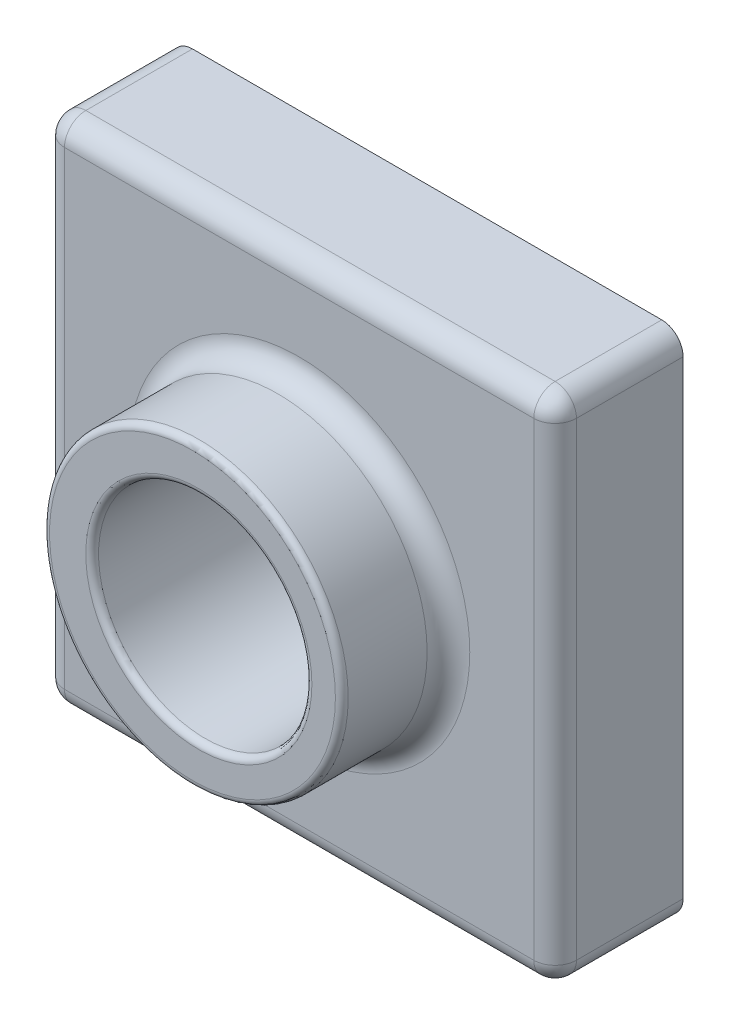
ISO-10303-21;
HEADER;
FILE_DESCRIPTION(('STEP AP214'),'2;1');
FILE_NAME('part.step','',(''),(''),'','','');
FILE_SCHEMA(('AUTOMOTIVE_DESIGN { 1 0 10303 214 1 1 1 1 }'));
ENDSEC;
DATA;
#1=APPLICATION_CONTEXT('core data for automotive mechanical design processes');
#2=APPLICATION_PROTOCOL_DEFINITION('international standard','automotive_design',2000,#1);
#3=PRODUCT_CONTEXT('',#1,'mechanical');
#4=PRODUCT('Part','Part','',(#3));
#5=PRODUCT_RELATED_PRODUCT_CATEGORY('part','',(#4));
#6=PRODUCT_DEFINITION_FORMATION('','',#4);
#7=PRODUCT_DEFINITION_CONTEXT('part definition',#1,'design');
#8=PRODUCT_DEFINITION('design','',#6,#7);
#9=PRODUCT_DEFINITION_SHAPE('','',#8);
#10=(LENGTH_UNIT() NAMED_UNIT(*) SI_UNIT(.MILLI.,.METRE.));
#11=(NAMED_UNIT(*) PLANE_ANGLE_UNIT() SI_UNIT($,.RADIAN.));
#12=(NAMED_UNIT(*) SI_UNIT($,.STERADIAN.) SOLID_ANGLE_UNIT());
#13=UNCERTAINTY_MEASURE_WITH_UNIT(LENGTH_MEASURE(1.E-05),#10,'distance_accuracy_value','');
#14=(GEOMETRIC_REPRESENTATION_CONTEXT(3) GLOBAL_UNCERTAINTY_ASSIGNED_CONTEXT((#13)) GLOBAL_UNIT_ASSIGNED_CONTEXT((#10,
#11,#12)) REPRESENTATION_CONTEXT('',''));
#15=CARTESIAN_POINT('',(0.,0.,0.));
#16=DIRECTION('',(0.,0.,1.));
#17=DIRECTION('',(1.,0.,0.));
#18=AXIS2_PLACEMENT_3D('',#15,#16,#17);
#19=CARTESIAN_POINT('',(0.,0.,0.));
#20=DIRECTION('',(0.,0.,1.));
#21=DIRECTION('',(1.,0.,0.));
#22=AXIS2_PLACEMENT_3D('',#19,#20,#21);
#23=PLANE('',#22);
#24=DIRECTION('',(1.,0.,0.));
#25=VECTOR('',#24,1.);
#26=CARTESIAN_POINT('',(0.,0.,0.));
#27=LINE('',#26,#25);
#28=CARTESIAN_POINT('',(5.,0.,0.));
#29=VERTEX_POINT('',#28);
#30=CARTESIAN_POINT('',(115.,0.,0.));
#31=VERTEX_POINT('',#30);
#32=EDGE_CURVE('E353',#29,#31,#27,.T.);
#33=ORIENTED_EDGE('',*,*,#32,.F.);
#34=CARTESIAN_POINT('',(5.,5.,0.));
#35=DIRECTION('',(0.,0.,1.));
#36=DIRECTION('',(1.,0.,0.));
#37=AXIS2_PLACEMENT_3D('',#34,#35,#36);
#38=CIRCLE('',#37,5.);
#39=CARTESIAN_POINT('',(0.,5.,0.));
#40=VERTEX_POINT('',#39);
#41=EDGE_CURVE('E427',#29,#40,#38,.F.);
#42=ORIENTED_EDGE('',*,*,#41,.T.);
#43=DIRECTION('',(0.,1.,0.));
#44=VECTOR('',#43,1.);
#45=CARTESIAN_POINT('',(0.,0.,0.));
#46=LINE('',#45,#44);
#47=CARTESIAN_POINT('',(0.,115.,0.));
#48=VERTEX_POINT('',#47);
#49=EDGE_CURVE('E357',#40,#48,#46,.T.);
#50=ORIENTED_EDGE('',*,*,#49,.T.);
#51=CARTESIAN_POINT('',(4.99999999999996,115.,0.));
#52=DIRECTION('',(0.,0.,1.));
#53=DIRECTION('',(1.,0.,0.));
#54=AXIS2_PLACEMENT_3D('',#51,#52,#53);
#55=CIRCLE('',#54,5.);
#56=CARTESIAN_POINT('',(4.99999999999996,120.,0.));
#57=VERTEX_POINT('',#56);
#58=EDGE_CURVE('E424',#48,#57,#55,.F.);
#59=ORIENTED_EDGE('',*,*,#58,.T.);
#60=DIRECTION('',(1.,0.,0.));
#61=VECTOR('',#60,1.);
#62=CARTESIAN_POINT('',(0.,120.,0.));
#63=LINE('',#62,#61);
#64=CARTESIAN_POINT('',(115.,120.,0.));
#65=VERTEX_POINT('',#64);
#66=EDGE_CURVE('E344',#57,#65,#63,.T.);
#67=ORIENTED_EDGE('',*,*,#66,.T.);
#68=CARTESIAN_POINT('',(115.,115.,0.));
#69=DIRECTION('',(0.,0.,1.));
#70=DIRECTION('',(1.,0.,0.));
#71=AXIS2_PLACEMENT_3D('',#68,#69,#70);
#72=CIRCLE('',#71,5.);
#73=CARTESIAN_POINT('',(120.,115.,0.));
#74=VERTEX_POINT('',#73);
#75=EDGE_CURVE('E418',#65,#74,#72,.F.);
#76=ORIENTED_EDGE('',*,*,#75,.T.);
#77=DIRECTION('',(0.,1.,0.));
#78=VECTOR('',#77,1.);
#79=CARTESIAN_POINT('',(120.,0.,0.));
#80=LINE('',#79,#78);
#81=CARTESIAN_POINT('',(120.,5.,0.));
#82=VERTEX_POINT('',#81);
#83=EDGE_CURVE('E349',#82,#74,#80,.T.);
#84=ORIENTED_EDGE('',*,*,#83,.F.);
#85=CARTESIAN_POINT('',(115.,5.,0.));
#86=DIRECTION('',(0.,0.,1.));
#87=DIRECTION('',(1.,0.,0.));
#88=AXIS2_PLACEMENT_3D('',#85,#86,#87);
#89=CIRCLE('',#88,5.);
#90=EDGE_CURVE('E421',#82,#31,#89,.F.);
#91=ORIENTED_EDGE('',*,*,#90,.T.);
#92=EDGE_LOOP('',(#33,#42,#50,#59,#67,#76,#84,#91));
#93=FACE_BOUND('',#92,.T.);
#94=CARTESIAN_POINT('',(5.,5.,0.));
#95=DIRECTION('',(0.,0.,1.));
#96=DIRECTION('',(1.,0.,0.));
#97=AXIS2_PLACEMENT_3D('',#94,#95,#96);
#98=CIRCLE('',#97,3.);
#99=CARTESIAN_POINT('',(5.,2.,0.));
#100=VERTEX_POINT('',#99);
#101=CARTESIAN_POINT('',(2.,5.,0.));
#102=VERTEX_POINT('',#101);
#103=EDGE_CURVE('E311',#100,#102,#98,.F.);
#104=ORIENTED_EDGE('',*,*,#103,.F.);
#105=DIRECTION('',(1.,0.,0.));
#106=VECTOR('',#105,1.);
#107=CARTESIAN_POINT('',(0.,2.,0.));
#108=LINE('',#107,#106);
#109=CARTESIAN_POINT('',(115.,2.,0.));
#110=VERTEX_POINT('',#109);
#111=EDGE_CURVE('E324',#100,#110,#108,.T.);
#112=ORIENTED_EDGE('',*,*,#111,.T.);
#113=CARTESIAN_POINT('',(115.,5.,0.));
#114=DIRECTION('',(0.,0.,1.));
#115=DIRECTION('',(1.,0.,0.));
#116=AXIS2_PLACEMENT_3D('',#113,#114,#115);
#117=CIRCLE('',#116,3.);
#118=CARTESIAN_POINT('',(118.,5.,0.));
#119=VERTEX_POINT('',#118);
#120=EDGE_CURVE('E321',#119,#110,#117,.F.);
#121=ORIENTED_EDGE('',*,*,#120,.F.);
#122=DIRECTION('',(0.,1.,0.));
#123=VECTOR('',#122,1.);
#124=CARTESIAN_POINT('',(118.,0.,0.));
#125=LINE('',#124,#123);
#126=CARTESIAN_POINT('',(118.,115.,0.));
#127=VERTEX_POINT('',#126);
#128=EDGE_CURVE('E55',#119,#127,#125,.T.);
#129=ORIENTED_EDGE('',*,*,#128,.T.);
#130=CARTESIAN_POINT('',(115.,115.,0.));
#131=DIRECTION('',(0.,0.,1.));
#132=DIRECTION('',(1.,0.,0.));
#133=AXIS2_PLACEMENT_3D('',#130,#131,#132);
#134=CIRCLE('',#133,3.);
#135=CARTESIAN_POINT('',(115.,118.,0.));
#136=VERTEX_POINT('',#135);
#137=EDGE_CURVE('E305',#136,#127,#134,.F.);
#138=ORIENTED_EDGE('',*,*,#137,.F.);
#139=DIRECTION('',(1.,0.,0.));
#140=VECTOR('',#139,1.);
#141=CARTESIAN_POINT('',(0.,118.,0.));
#142=LINE('',#141,#140);
#143=CARTESIAN_POINT('',(4.99999999999996,118.,0.));
#144=VERTEX_POINT('',#143);
#145=EDGE_CURVE('E316',#144,#136,#142,.T.);
#146=ORIENTED_EDGE('',*,*,#145,.F.);
#147=CARTESIAN_POINT('',(4.99999999999996,115.,0.));
#148=DIRECTION('',(0.,0.,1.));
#149=DIRECTION('',(1.,0.,0.));
#150=AXIS2_PLACEMENT_3D('',#147,#148,#149);
#151=CIRCLE('',#150,3.);
#152=CARTESIAN_POINT('',(1.99999999999996,115.,0.));
#153=VERTEX_POINT('',#152);
#154=EDGE_CURVE('E185',#153,#144,#151,.F.);
#155=ORIENTED_EDGE('',*,*,#154,.F.);
#156=DIRECTION('',(0.,1.,0.));
#157=VECTOR('',#156,1.);
#158=CARTESIAN_POINT('',(2.,0.,0.));
#159=LINE('',#158,#157);
#160=EDGE_CURVE('E271',#102,#153,#159,.T.);
#161=ORIENTED_EDGE('',*,*,#160,.F.);
#162=EDGE_LOOP('',(#104,#112,#121,#129,#138,#146,#155,#161));
#163=FACE_BOUND('',#162,.T.);
#164=ADVANCED_FACE('F39',(#93,#163),#23,.F.);
#165=CARTESIAN_POINT('',(0.,120.,30.));
#166=DIRECTION('',(0.,1.,0.));
#167=DIRECTION('',(0.,0.,1.));
#168=AXIS2_PLACEMENT_3D('',#165,#166,#167);
#169=PLANE('',#168);
#170=ORIENTED_EDGE('',*,*,#66,.F.);
#171=DIRECTION('',(0.,0.,-1.));
#172=VECTOR('',#171,1.);
#173=CARTESIAN_POINT('',(4.99999999999996,120.,30.));
#174=LINE('',#173,#172);
#175=CARTESIAN_POINT('',(4.99999999999996,120.,25.));
#176=VERTEX_POINT('',#175);
#177=EDGE_CURVE('E63',#57,#176,#174,.F.);
#178=ORIENTED_EDGE('',*,*,#177,.T.);
#179=DIRECTION('',(1.,0.,0.));
#180=VECTOR('',#179,1.);
#181=CARTESIAN_POINT('',(0.,120.,25.));
#182=LINE('',#181,#180);
#183=CARTESIAN_POINT('',(115.,120.,25.));
#184=VERTEX_POINT('',#183);
#185=EDGE_CURVE('E409',#176,#184,#182,.T.);
#186=ORIENTED_EDGE('',*,*,#185,.T.);
#187=DIRECTION('',(0.,0.,-1.));
#188=VECTOR('',#187,1.);
#189=CARTESIAN_POINT('',(115.,120.,0.));
#190=LINE('',#189,#188);
#191=EDGE_CURVE('E406',#184,#65,#190,.T.);
#192=ORIENTED_EDGE('',*,*,#191,.T.);
#193=EDGE_LOOP('',(#170,#178,#186,#192));
#194=FACE_BOUND('',#193,.T.);
#195=ADVANCED_FACE('F527',(#194),#169,.T.);
#196=CARTESIAN_POINT('',(0.,0.,30.));
#197=DIRECTION('',(-1.,0.,0.));
#198=DIRECTION('',(0.,-1.,0.));
#199=AXIS2_PLACEMENT_3D('',#196,#197,#198);
#200=PLANE('',#199);
#201=ORIENTED_EDGE('',*,*,#49,.F.);
#202=DIRECTION('',(0.,0.,-1.));
#203=VECTOR('',#202,1.);
#204=CARTESIAN_POINT('',(0.,5.,30.));
#205=LINE('',#204,#203);
#206=CARTESIAN_POINT('',(0.,5.,25.));
#207=VERTEX_POINT('',#206);
#208=EDGE_CURVE('E403',#40,#207,#205,.F.);
#209=ORIENTED_EDGE('',*,*,#208,.T.);
#210=DIRECTION('',(0.,1.,0.));
#211=VECTOR('',#210,1.);
#212=CARTESIAN_POINT('',(0.,0.,25.));
#213=LINE('',#212,#211);
#214=CARTESIAN_POINT('',(0.,115.,25.));
#215=VERTEX_POINT('',#214);
#216=EDGE_CURVE('E400',#207,#215,#213,.T.);
#217=ORIENTED_EDGE('',*,*,#216,.T.);
#218=DIRECTION('',(0.,0.,-1.));
#219=VECTOR('',#218,1.);
#220=CARTESIAN_POINT('',(0.,115.,30.));
#221=LINE('',#220,#219);
#222=EDGE_CURVE('E397',#215,#48,#221,.T.);
#223=ORIENTED_EDGE('',*,*,#222,.T.);
#224=EDGE_LOOP('',(#201,#209,#217,#223));
#225=FACE_BOUND('',#224,.T.);
#226=ADVANCED_FACE('F532',(#225),#200,.T.);
#227=CARTESIAN_POINT('',(0.,0.,30.));
#228=DIRECTION('',(0.,1.,0.));
#229=DIRECTION('',(0.,0.,1.));
#230=AXIS2_PLACEMENT_3D('',#227,#228,#229);
#231=PLANE('',#230);
#232=DIRECTION('',(1.,0.,0.));
#233=VECTOR('',#232,1.);
#234=CARTESIAN_POINT('',(0.,0.,25.));
#235=LINE('',#234,#233);
#236=CARTESIAN_POINT('',(115.,0.,25.));
#237=VERTEX_POINT('',#236);
#238=CARTESIAN_POINT('',(5.,0.,25.));
#239=VERTEX_POINT('',#238);
#240=EDGE_CURVE('E391',#237,#239,#235,.F.);
#241=ORIENTED_EDGE('',*,*,#240,.T.);
#242=DIRECTION('',(0.,0.,-1.));
#243=VECTOR('',#242,1.);
#244=CARTESIAN_POINT('',(5.,0.,0.));
#245=LINE('',#244,#243);
#246=EDGE_CURVE('E394',#239,#29,#245,.T.);
#247=ORIENTED_EDGE('',*,*,#246,.T.);
#248=ORIENTED_EDGE('',*,*,#32,.T.);
#249=DIRECTION('',(0.,0.,-1.));
#250=VECTOR('',#249,1.);
#251=CARTESIAN_POINT('',(115.,0.,30.));
#252=LINE('',#251,#250);
#253=EDGE_CURVE('E388',#31,#237,#252,.F.);
#254=ORIENTED_EDGE('',*,*,#253,.T.);
#255=EDGE_LOOP('',(#241,#247,#248,#254));
#256=FACE_BOUND('',#255,.T.);
#257=ADVANCED_FACE('F909',(#256),#231,.F.);
#258=CARTESIAN_POINT('',(120.,0.,30.));
#259=DIRECTION('',(-1.,0.,0.));
#260=DIRECTION('',(0.,-1.,0.));
#261=AXIS2_PLACEMENT_3D('',#258,#259,#260);
#262=PLANE('',#261);
#263=DIRECTION('',(0.,1.,0.));
#264=VECTOR('',#263,1.);
#265=CARTESIAN_POINT('',(120.,0.,25.));
#266=LINE('',#265,#264);
#267=CARTESIAN_POINT('',(120.,115.,25.));
#268=VERTEX_POINT('',#267);
#269=CARTESIAN_POINT('',(120.,5.,25.));
#270=VERTEX_POINT('',#269);
#271=EDGE_CURVE('E381',#268,#270,#266,.F.);
#272=ORIENTED_EDGE('',*,*,#271,.T.);
#273=DIRECTION('',(0.,0.,-1.));
#274=VECTOR('',#273,1.);
#275=CARTESIAN_POINT('',(120.,5.,30.));
#276=LINE('',#275,#274);
#277=EDGE_CURVE('E385',#270,#82,#276,.T.);
#278=ORIENTED_EDGE('',*,*,#277,.T.);
#279=ORIENTED_EDGE('',*,*,#83,.T.);
#280=DIRECTION('',(0.,0.,-1.));
#281=VECTOR('',#280,1.);
#282=CARTESIAN_POINT('',(120.,115.,30.));
#283=LINE('',#282,#281);
#284=EDGE_CURVE('E378',#74,#268,#283,.F.);
#285=ORIENTED_EDGE('',*,*,#284,.T.);
#286=EDGE_LOOP('',(#272,#278,#279,#285));
#287=FACE_BOUND('',#286,.T.);
#288=ADVANCED_FACE('F521',(#287),#262,.F.);
#289=CARTESIAN_POINT('',(0.,0.,30.));
#290=DIRECTION('',(0.,0.,1.));
#291=DIRECTION('',(1.,0.,0.));
#292=AXIS2_PLACEMENT_3D('',#289,#290,#291);
#293=PLANE('',#292);
#294=DIRECTION('',(1.,0.,0.));
#295=VECTOR('',#294,1.);
#296=CARTESIAN_POINT('',(120.,5.,30.));
#297=LINE('',#296,#295);
#298=CARTESIAN_POINT('',(5.,5.,30.));
#299=VERTEX_POINT('',#298);
#300=CARTESIAN_POINT('',(115.,5.,30.));
#301=VERTEX_POINT('',#300);
#302=EDGE_CURVE('E371',#299,#301,#297,.T.);
#303=ORIENTED_EDGE('',*,*,#302,.T.);
#304=DIRECTION('',(0.,1.,0.));
#305=VECTOR('',#304,1.);
#306=CARTESIAN_POINT('',(115.,120.,30.));
#307=LINE('',#306,#305);
#308=CARTESIAN_POINT('',(115.,115.,30.));
#309=VERTEX_POINT('',#308);
#310=EDGE_CURVE('E374',#301,#309,#307,.T.);
#311=ORIENTED_EDGE('',*,*,#310,.T.);
#312=DIRECTION('',(1.,0.,0.));
#313=VECTOR('',#312,1.);
#314=CARTESIAN_POINT('',(0.,115.,30.));
#315=LINE('',#314,#313);
#316=CARTESIAN_POINT('',(4.99999999999996,115.,30.));
#317=VERTEX_POINT('',#316);
#318=EDGE_CURVE('E365',#309,#317,#315,.F.);
#319=ORIENTED_EDGE('',*,*,#318,.T.);
#320=DIRECTION('',(0.,1.,0.));
#321=VECTOR('',#320,1.);
#322=CARTESIAN_POINT('',(5.,0.,30.));
#323=LINE('',#322,#321);
#324=EDGE_CURVE('E368',#317,#299,#323,.F.);
#325=ORIENTED_EDGE('',*,*,#324,.T.);
#326=EDGE_LOOP('',(#303,#311,#319,#325));
#327=FACE_BOUND('',#326,.T.);
#328=CARTESIAN_POINT('',(60.,60.,30.));
#329=DIRECTION('',(0.,0.,1.));
#330=DIRECTION('',(1.,0.,0.));
#331=AXIS2_PLACEMENT_3D('',#328,#329,#330);
#332=CIRCLE('',#331,40.);
#333=CARTESIAN_POINT('',(100.,60.,30.));
#334=VERTEX_POINT('',#333);
#335=EDGE_CURVE('E361',#334,#334,#332,.F.);
#336=ORIENTED_EDGE('',*,*,#335,.T.);
#337=EDGE_LOOP('',(#336));
#338=FACE_BOUND('',#337,.T.);
#339=ADVANCED_FACE('F513',(#327,#338),#293,.T.);
#340=CARTESIAN_POINT('',(61.490735972261,60.0000000000002,0.));
#341=DIRECTION('',(0.,0.,1.));
#342=DIRECTION('',(1.,0.,0.));
#343=AXIS2_PLACEMENT_3D('',#340,#341,#342);
#344=CIRCLE('',#343,27.);
#345=CARTESIAN_POINT('',(88.490735972261,60.0000000000002,0.));
#346=VERTEX_POINT('',#345);
#347=EDGE_CURVE('E240',#346,#346,#344,.T.);
#348=ORIENTED_EDGE('',*,*,#347,.F.);
#349=EDGE_LOOP('',(#348));
#350=FACE_BOUND('',#349,.T.);
#351=CARTESIAN_POINT('',(61.490735972261,60.0000000000002,0.));
#352=DIRECTION('',(0.,0.,1.));
#353=DIRECTION('',(1.,0.,0.));
#354=AXIS2_PLACEMENT_3D('',#351,#352,#353);
#355=CIRCLE('',#354,25.);
#356=CARTESIAN_POINT('',(86.490735972261,60.0000000000002,0.));
#357=VERTEX_POINT('',#356);
#358=EDGE_CURVE('E340',#357,#357,#355,.T.);
#359=ORIENTED_EDGE('',*,*,#358,.T.);
#360=EDGE_LOOP('',(#359));
#361=FACE_BOUND('',#360,.T.);
#362=ADVANCED_FACE('F511',(#350,#361),#23,.F.);
#363=CARTESIAN_POINT('',(60.,60.,55.));
#364=DIRECTION('',(0.,0.,-1.));
#365=DIRECTION('',(-1.,0.,0.));
#366=AXIS2_PLACEMENT_3D('',#363,#364,#365);
#367=CYLINDRICAL_SURFACE('',#366,35.);
#368=CARTESIAN_POINT('',(60.,60.,53.5));
#369=DIRECTION('',(0.,0.,1.));
#370=DIRECTION('',(1.,0.,0.));
#371=AXIS2_PLACEMENT_3D('',#368,#369,#370);
#372=CIRCLE('',#371,35.);
#373=CARTESIAN_POINT('',(95.,60.,53.5));
#374=VERTEX_POINT('',#373);
#375=EDGE_CURVE('E48',#374,#374,#372,.F.);
#376=ORIENTED_EDGE('',*,*,#375,.T.);
#377=EDGE_LOOP('',(#376));
#378=FACE_BOUND('',#377,.T.);
#379=CARTESIAN_POINT('',(60.,60.,35.));
#380=DIRECTION('',(0.,0.,1.));
#381=DIRECTION('',(1.,0.,0.));
#382=AXIS2_PLACEMENT_3D('',#379,#380,#381);
#383=CIRCLE('',#382,35.);
#384=CARTESIAN_POINT('',(95.,60.,35.));
#385=VERTEX_POINT('',#384);
#386=EDGE_CURVE('E414',#385,#385,#383,.T.);
#387=ORIENTED_EDGE('',*,*,#386,.T.);
#388=EDGE_LOOP('',(#387));
#389=FACE_BOUND('',#388,.T.);
#390=ADVANCED_FACE('F485',(#378,#389),#367,.T.);
#391=CARTESIAN_POINT('',(60.,60.,55.));
#392=DIRECTION('',(0.,0.,1.));
#393=DIRECTION('',(1.,0.,0.));
#394=AXIS2_PLACEMENT_3D('',#391,#392,#393);
#395=PLANE('',#394);
#396=CARTESIAN_POINT('',(60.,60.,55.));
#397=DIRECTION('',(0.,0.,1.));
#398=DIRECTION('',(1.,0.,0.));
#399=AXIS2_PLACEMENT_3D('',#396,#397,#398);
#400=CIRCLE('',#399,33.5);
#401=CARTESIAN_POINT('',(93.5,60.,55.));
#402=VERTEX_POINT('',#401);
#403=EDGE_CURVE('E478',#402,#402,#400,.T.);
#404=ORIENTED_EDGE('',*,*,#403,.T.);
#405=EDGE_LOOP('',(#404));
#406=FACE_BOUND('',#405,.T.);
#407=CARTESIAN_POINT('',(61.490735972261,60.0000000000002,55.));
#408=DIRECTION('',(0.,0.,1.));
#409=DIRECTION('',(1.,0.,0.));
#410=AXIS2_PLACEMENT_3D('',#407,#408,#409);
#411=CIRCLE('',#410,26.5);
#412=CARTESIAN_POINT('',(87.990735972261,60.0000000000002,55.));
#413=VERTEX_POINT('',#412);
#414=EDGE_CURVE('E430',#413,#413,#411,.F.);
#415=ORIENTED_EDGE('',*,*,#414,.T.);
#416=EDGE_LOOP('',(#415));
#417=FACE_BOUND('',#416,.T.);
#418=ADVANCED_FACE('F494',(#406,#417),#395,.T.);
#419=CARTESIAN_POINT('',(61.490735972261,60.0000000000002,0.));
#420=DIRECTION('',(0.,0.,1.));
#421=DIRECTION('',(1.,0.,0.));
#422=AXIS2_PLACEMENT_3D('',#419,#420,#421);
#423=CYLINDRICAL_SURFACE('',#422,25.);
#424=CARTESIAN_POINT('',(61.490735972261,60.0000000000002,53.5));
#425=DIRECTION('',(0.,0.,1.));
#426=DIRECTION('',(1.,0.,0.));
#427=AXIS2_PLACEMENT_3D('',#424,#425,#426);
#428=CIRCLE('',#427,25.);
#429=CARTESIAN_POINT('',(86.490735972261,60.0000000000002,53.5));
#430=VERTEX_POINT('',#429);
#431=EDGE_CURVE('E11',#430,#430,#428,.T.);
#432=ORIENTED_EDGE('',*,*,#431,.T.);
#433=EDGE_LOOP('',(#432));
#434=FACE_BOUND('',#433,.T.);
#435=ORIENTED_EDGE('',*,*,#358,.F.);
#436=EDGE_LOOP('',(#435));
#437=FACE_BOUND('',#436,.T.);
#438=ADVANCED_FACE('F497',(#434,#437),#423,.F.);
#439=CARTESIAN_POINT('',(5.,5.,30.));
#440=DIRECTION('',(0.,0.,1.));
#441=DIRECTION('',(1.,0.,0.));
#442=AXIS2_PLACEMENT_3D('',#439,#440,#441);
#443=CYLINDRICAL_SURFACE('',#442,5.);
#444=ORIENTED_EDGE('',*,*,#41,.F.);
#445=ORIENTED_EDGE('',*,*,#246,.F.);
#446=CARTESIAN_POINT('',(5.,5.,25.));
#447=DIRECTION('',(0.,0.,1.));
#448=DIRECTION('',(1.,0.,0.));
#449=AXIS2_PLACEMENT_3D('',#446,#447,#448);
#450=CIRCLE('',#449,5.);
#451=EDGE_CURVE('E345',#207,#239,#450,.T.);
#452=ORIENTED_EDGE('',*,*,#451,.F.);
#453=ORIENTED_EDGE('',*,*,#208,.F.);
#454=EDGE_LOOP('',(#444,#445,#452,#453));
#455=FACE_BOUND('',#454,.T.);
#456=ADVANCED_FACE('F507',(#455),#443,.T.);
#457=CARTESIAN_POINT('',(5.,0.,25.));
#458=DIRECTION('',(0.,1.,0.));
#459=DIRECTION('',(-1.,0.,0.));
#460=AXIS2_PLACEMENT_3D('',#457,#458,#459);
#461=CYLINDRICAL_SURFACE('',#460,5.);
#462=CARTESIAN_POINT('',(4.99999999999996,115.,25.));
#463=DIRECTION('',(0.,1.,0.));
#464=DIRECTION('',(0.,0.,1.));
#465=AXIS2_PLACEMENT_3D('',#462,#463,#464);
#466=CIRCLE('',#465,5.);
#467=EDGE_CURVE('E464',#215,#317,#466,.T.);
#468=ORIENTED_EDGE('',*,*,#467,.F.);
#469=ORIENTED_EDGE('',*,*,#216,.F.);
#470=CARTESIAN_POINT('',(5.,5.,25.));
#471=DIRECTION('',(0.,-1.,0.));
#472=DIRECTION('',(1.,0.,0.));
#473=AXIS2_PLACEMENT_3D('',#470,#471,#472);
#474=CIRCLE('',#473,5.);
#475=EDGE_CURVE('E468',#299,#207,#474,.T.);
#476=ORIENTED_EDGE('',*,*,#475,.F.);
#477=ORIENTED_EDGE('',*,*,#324,.F.);
#478=EDGE_LOOP('',(#468,#469,#476,#477));
#479=FACE_BOUND('',#478,.T.);
#480=ADVANCED_FACE('F862',(#479),#461,.T.);
#481=CARTESIAN_POINT('',(4.99999999999996,115.,30.));
#482=DIRECTION('',(0.,0.,-1.));
#483=DIRECTION('',(-1.,0.,0.));
#484=AXIS2_PLACEMENT_3D('',#481,#482,#483);
#485=CYLINDRICAL_SURFACE('',#484,5.);
#486=ORIENTED_EDGE('',*,*,#58,.F.);
#487=ORIENTED_EDGE('',*,*,#222,.F.);
#488=CARTESIAN_POINT('',(4.99999999999996,115.,25.));
#489=DIRECTION('',(0.,0.,1.));
#490=DIRECTION('',(1.,0.,0.));
#491=AXIS2_PLACEMENT_3D('',#488,#489,#490);
#492=CIRCLE('',#491,5.);
#493=EDGE_CURVE('E460',#176,#215,#492,.T.);
#494=ORIENTED_EDGE('',*,*,#493,.F.);
#495=ORIENTED_EDGE('',*,*,#177,.F.);
#496=EDGE_LOOP('',(#486,#487,#494,#495));
#497=FACE_BOUND('',#496,.T.);
#498=ADVANCED_FACE('F853',(#497),#485,.T.);
#499=CARTESIAN_POINT('',(5.,5.,25.));
#500=DIRECTION('',(-1.,0.,0.));
#501=DIRECTION('',(0.,-1.,0.));
#502=AXIS2_PLACEMENT_3D('',#499,#500,#501);
#503=SPHERICAL_SURFACE('',#502,5.);
#504=ORIENTED_EDGE('',*,*,#475,.T.);
#505=ORIENTED_EDGE('',*,*,#451,.T.);
#506=CARTESIAN_POINT('',(5.,5.,25.));
#507=DIRECTION('',(-1.,0.,0.));
#508=DIRECTION('',(0.,0.,1.));
#509=AXIS2_PLACEMENT_3D('',#506,#507,#508);
#510=CIRCLE('',#509,5.);
#511=EDGE_CURVE('E456',#299,#239,#510,.F.);
#512=ORIENTED_EDGE('',*,*,#511,.F.);
#513=EDGE_LOOP('',(#504,#505,#512));
#514=FACE_BOUND('',#513,.T.);
#515=ADVANCED_FACE('F844',(#514),#503,.T.);
#516=CARTESIAN_POINT('',(4.99999999999996,115.,25.));
#517=DIRECTION('',(-1.,0.,0.));
#518=DIRECTION('',(0.,0.,1.));
#519=AXIS2_PLACEMENT_3D('',#516,#517,#518);
#520=SPHERICAL_SURFACE('',#519,5.);
#521=ORIENTED_EDGE('',*,*,#493,.T.);
#522=ORIENTED_EDGE('',*,*,#467,.T.);
#523=CARTESIAN_POINT('',(4.99999999999996,115.,25.));
#524=DIRECTION('',(-1.,0.,0.));
#525=DIRECTION('',(0.,0.,1.));
#526=AXIS2_PLACEMENT_3D('',#523,#524,#525);
#527=CIRCLE('',#526,5.);
#528=EDGE_CURVE('E452',#176,#317,#527,.F.);
#529=ORIENTED_EDGE('',*,*,#528,.F.);
#530=EDGE_LOOP('',(#521,#522,#529));
#531=FACE_BOUND('',#530,.T.);
#532=ADVANCED_FACE('F835',(#531),#520,.T.);
#533=CARTESIAN_POINT('',(115.,5.,30.));
#534=DIRECTION('',(0.,0.,-1.));
#535=DIRECTION('',(-1.,0.,0.));
#536=AXIS2_PLACEMENT_3D('',#533,#534,#535);
#537=CYLINDRICAL_SURFACE('',#536,5.);
#538=ORIENTED_EDGE('',*,*,#90,.F.);
#539=ORIENTED_EDGE('',*,*,#277,.F.);
#540=CARTESIAN_POINT('',(115.,5.,25.));
#541=DIRECTION('',(0.,0.,1.));
#542=DIRECTION('',(1.,0.,0.));
#543=AXIS2_PLACEMENT_3D('',#540,#541,#542);
#544=CIRCLE('',#543,5.);
#545=EDGE_CURVE('E448',#237,#270,#544,.T.);
#546=ORIENTED_EDGE('',*,*,#545,.F.);
#547=ORIENTED_EDGE('',*,*,#253,.F.);
#548=EDGE_LOOP('',(#538,#539,#546,#547));
#549=FACE_BOUND('',#548,.T.);
#550=ADVANCED_FACE('F826',(#549),#537,.T.);
#551=CARTESIAN_POINT('',(0.,5.,25.));
#552=DIRECTION('',(-1.,0.,0.));
#553=DIRECTION('',(0.,0.,1.));
#554=AXIS2_PLACEMENT_3D('',#551,#552,#553);
#555=CYLINDRICAL_SURFACE('',#554,5.);
#556=ORIENTED_EDGE('',*,*,#511,.T.);
#557=ORIENTED_EDGE('',*,*,#240,.F.);
#558=CARTESIAN_POINT('',(115.,5.,25.));
#559=DIRECTION('',(1.,0.,0.));
#560=DIRECTION('',(0.,0.,-1.));
#561=AXIS2_PLACEMENT_3D('',#558,#559,#560);
#562=CIRCLE('',#561,5.);
#563=EDGE_CURVE('E444',#301,#237,#562,.T.);
#564=ORIENTED_EDGE('',*,*,#563,.F.);
#565=ORIENTED_EDGE('',*,*,#302,.F.);
#566=EDGE_LOOP('',(#556,#557,#564,#565));
#567=FACE_BOUND('',#566,.T.);
#568=ADVANCED_FACE('F817',(#567),#555,.T.);
#569=CARTESIAN_POINT('',(0.,115.,25.));
#570=DIRECTION('',(1.,0.,0.));
#571=DIRECTION('',(0.,0.,-1.));
#572=AXIS2_PLACEMENT_3D('',#569,#570,#571);
#573=CYLINDRICAL_SURFACE('',#572,5.);
#574=ORIENTED_EDGE('',*,*,#528,.T.);
#575=ORIENTED_EDGE('',*,*,#318,.F.);
#576=CARTESIAN_POINT('',(115.,115.,25.));
#577=DIRECTION('',(1.,0.,0.));
#578=DIRECTION('',(0.,0.,-1.));
#579=AXIS2_PLACEMENT_3D('',#576,#577,#578);
#580=CIRCLE('',#579,5.);
#581=EDGE_CURVE('E440',#184,#309,#580,.T.);
#582=ORIENTED_EDGE('',*,*,#581,.F.);
#583=ORIENTED_EDGE('',*,*,#185,.F.);
#584=EDGE_LOOP('',(#574,#575,#582,#583));
#585=FACE_BOUND('',#584,.T.);
#586=ADVANCED_FACE('F808',(#585),#573,.T.);
#587=CARTESIAN_POINT('',(115.,115.,30.));
#588=DIRECTION('',(0.,0.,1.));
#589=DIRECTION('',(1.,0.,0.));
#590=AXIS2_PLACEMENT_3D('',#587,#588,#589);
#591=CYLINDRICAL_SURFACE('',#590,5.);
#592=ORIENTED_EDGE('',*,*,#75,.F.);
#593=ORIENTED_EDGE('',*,*,#191,.F.);
#594=CARTESIAN_POINT('',(115.,115.,25.));
#595=DIRECTION('',(0.,0.,1.));
#596=DIRECTION('',(1.,0.,0.));
#597=AXIS2_PLACEMENT_3D('',#594,#595,#596);
#598=CIRCLE('',#597,5.);
#599=EDGE_CURVE('E436',#268,#184,#598,.T.);
#600=ORIENTED_EDGE('',*,*,#599,.F.);
#601=ORIENTED_EDGE('',*,*,#284,.F.);
#602=EDGE_LOOP('',(#592,#593,#600,#601));
#603=FACE_BOUND('',#602,.T.);
#604=ADVANCED_FACE('F799',(#603),#591,.T.);
#605=CARTESIAN_POINT('',(115.,5.,25.));
#606=DIRECTION('',(0.,-1.,0.));
#607=DIRECTION('',(0.,0.,-1.));
#608=AXIS2_PLACEMENT_3D('',#605,#606,#607);
#609=SPHERICAL_SURFACE('',#608,5.);
#610=ORIENTED_EDGE('',*,*,#563,.T.);
#611=ORIENTED_EDGE('',*,*,#545,.T.);
#612=CARTESIAN_POINT('',(115.,5.,25.));
#613=DIRECTION('',(0.,-1.,0.));
#614=DIRECTION('',(1.,0.,0.));
#615=AXIS2_PLACEMENT_3D('',#612,#613,#614);
#616=CIRCLE('',#615,5.);
#617=EDGE_CURVE('E433',#301,#270,#616,.F.);
#618=ORIENTED_EDGE('',*,*,#617,.F.);
#619=EDGE_LOOP('',(#610,#611,#618));
#620=FACE_BOUND('',#619,.T.);
#621=ADVANCED_FACE('F790',(#620),#609,.T.);
#622=CARTESIAN_POINT('',(115.,115.,25.));
#623=DIRECTION('',(0.,1.,0.));
#624=DIRECTION('',(0.,0.,1.));
#625=AXIS2_PLACEMENT_3D('',#622,#623,#624);
#626=SPHERICAL_SURFACE('',#625,5.);
#627=ORIENTED_EDGE('',*,*,#599,.T.);
#628=ORIENTED_EDGE('',*,*,#581,.T.);
#629=CARTESIAN_POINT('',(115.,115.,25.));
#630=DIRECTION('',(0.,1.,0.));
#631=DIRECTION('',(0.,0.,1.));
#632=AXIS2_PLACEMENT_3D('',#629,#630,#631);
#633=CIRCLE('',#632,5.);
#634=EDGE_CURVE('E315',#268,#309,#633,.F.);
#635=ORIENTED_EDGE('',*,*,#634,.F.);
#636=EDGE_LOOP('',(#627,#628,#635));
#637=FACE_BOUND('',#636,.T.);
#638=ADVANCED_FACE('F781',(#637),#626,.T.);
#639=CARTESIAN_POINT('',(115.,0.,25.));
#640=DIRECTION('',(0.,-1.,0.));
#641=DIRECTION('',(1.,0.,0.));
#642=AXIS2_PLACEMENT_3D('',#639,#640,#641);
#643=CYLINDRICAL_SURFACE('',#642,5.);
#644=ORIENTED_EDGE('',*,*,#617,.T.);
#645=ORIENTED_EDGE('',*,*,#271,.F.);
#646=ORIENTED_EDGE('',*,*,#634,.T.);
#647=ORIENTED_EDGE('',*,*,#310,.F.);
#648=EDGE_LOOP('',(#644,#645,#646,#647));
#649=FACE_BOUND('',#648,.T.);
#650=ADVANCED_FACE('F771',(#649),#643,.T.);
#651=CARTESIAN_POINT('',(60.,60.,35.));
#652=DIRECTION('',(0.,0.,1.));
#653=DIRECTION('',(1.,0.,0.));
#654=AXIS2_PLACEMENT_3D('',#651,#652,#653);
#655=TOROIDAL_SURFACE('',#654,40.,5.);
#656=ORIENTED_EDGE('',*,*,#335,.F.);
#657=EDGE_LOOP('',(#656));
#658=FACE_BOUND('',#657,.T.);
#659=ORIENTED_EDGE('',*,*,#386,.F.);
#660=EDGE_LOOP('',(#659));
#661=FACE_BOUND('',#660,.T.);
#662=ADVANCED_FACE('F491',(#658,#661),#655,.F.);
#663=CARTESIAN_POINT('',(60.,60.,53.5));
#664=DIRECTION('',(0.,0.,1.));
#665=DIRECTION('',(1.,0.,0.));
#666=AXIS2_PLACEMENT_3D('',#663,#664,#665);
#667=TOROIDAL_SURFACE('',#666,33.5,1.5);
#668=ORIENTED_EDGE('',*,*,#375,.F.);
#669=EDGE_LOOP('',(#668));
#670=FACE_BOUND('',#669,.T.);
#671=ORIENTED_EDGE('',*,*,#403,.F.);
#672=EDGE_LOOP('',(#671));
#673=FACE_BOUND('',#672,.T.);
#674=ADVANCED_FACE('F488',(#670,#673),#667,.T.);
#675=CARTESIAN_POINT('',(61.490735972261,60.0000000000002,53.5));
#676=DIRECTION('',(0.,0.,1.));
#677=DIRECTION('',(1.,0.,0.));
#678=AXIS2_PLACEMENT_3D('',#675,#676,#677);
#679=TOROIDAL_SURFACE('',#678,26.5,1.5);
#680=ORIENTED_EDGE('',*,*,#414,.F.);
#681=EDGE_LOOP('',(#680));
#682=FACE_BOUND('',#681,.T.);
#683=ORIENTED_EDGE('',*,*,#431,.F.);
#684=EDGE_LOOP('',(#683));
#685=FACE_BOUND('',#684,.T.);
#686=ADVANCED_FACE('F41',(#682,#685),#679,.T.);
#687=CARTESIAN_POINT('',(0.,118.,30.));
#688=DIRECTION('',(0.,1.,0.));
#689=DIRECTION('',(0.,0.,1.));
#690=AXIS2_PLACEMENT_3D('',#687,#688,#689);
#691=PLANE('',#690);
#692=ORIENTED_EDGE('',*,*,#145,.T.);
#693=DIRECTION('',(0.,0.,1.));
#694=VECTOR('',#693,1.);
#695=CARTESIAN_POINT('',(115.,118.,30.));
#696=LINE('',#695,#694);
#697=CARTESIAN_POINT('',(115.,118.,25.));
#698=VERTEX_POINT('',#697);
#699=EDGE_CURVE('E216',#698,#136,#696,.F.);
#700=ORIENTED_EDGE('',*,*,#699,.F.);
#701=DIRECTION('',(1.,0.,0.));
#702=VECTOR('',#701,1.);
#703=CARTESIAN_POINT('',(0.,118.,25.));
#704=LINE('',#703,#702);
#705=CARTESIAN_POINT('',(4.99999999999996,118.,25.));
#706=VERTEX_POINT('',#705);
#707=EDGE_CURVE('E192',#706,#698,#704,.T.);
#708=ORIENTED_EDGE('',*,*,#707,.F.);
#709=DIRECTION('',(0.,0.,1.));
#710=VECTOR('',#709,1.);
#711=CARTESIAN_POINT('',(4.99999999999996,118.,30.));
#712=LINE('',#711,#710);
#713=EDGE_CURVE('E180',#144,#706,#712,.T.);
#714=ORIENTED_EDGE('',*,*,#713,.F.);
#715=EDGE_LOOP('',(#692,#700,#708,#714));
#716=FACE_BOUND('',#715,.T.);
#717=ADVANCED_FACE('F215',(#716),#691,.F.);
#718=CARTESIAN_POINT('',(2.,0.,30.));
#719=DIRECTION('',(-1.,0.,0.));
#720=DIRECTION('',(0.,-1.,0.));
#721=AXIS2_PLACEMENT_3D('',#718,#719,#720);
#722=PLANE('',#721);
#723=ORIENTED_EDGE('',*,*,#160,.T.);
#724=DIRECTION('',(0.,0.,1.));
#725=VECTOR('',#724,1.);
#726=CARTESIAN_POINT('',(1.99999999999996,115.,30.));
#727=LINE('',#726,#725);
#728=CARTESIAN_POINT('',(1.99999999999996,115.,25.));
#729=VERTEX_POINT('',#728);
#730=EDGE_CURVE('E224',#729,#153,#727,.F.);
#731=ORIENTED_EDGE('',*,*,#730,.F.);
#732=DIRECTION('',(0.,-1.,0.));
#733=VECTOR('',#732,1.);
#734=CARTESIAN_POINT('',(2.,0.,25.));
#735=LINE('',#734,#733);
#736=CARTESIAN_POINT('',(2.,5.,25.));
#737=VERTEX_POINT('',#736);
#738=EDGE_CURVE('E226',#737,#729,#735,.F.);
#739=ORIENTED_EDGE('',*,*,#738,.F.);
#740=DIRECTION('',(0.,0.,1.));
#741=VECTOR('',#740,1.);
#742=CARTESIAN_POINT('',(2.,5.,30.));
#743=LINE('',#742,#741);
#744=EDGE_CURVE('E221',#102,#737,#743,.T.);
#745=ORIENTED_EDGE('',*,*,#744,.F.);
#746=EDGE_LOOP('',(#723,#731,#739,#745));
#747=FACE_BOUND('',#746,.T.);
#748=ADVANCED_FACE('F547',(#747),#722,.F.);
#749=CARTESIAN_POINT('',(0.,2.,30.));
#750=DIRECTION('',(0.,1.,0.));
#751=DIRECTION('',(0.,0.,1.));
#752=AXIS2_PLACEMENT_3D('',#749,#750,#751);
#753=PLANE('',#752);
#754=DIRECTION('',(1.,0.,0.));
#755=VECTOR('',#754,1.);
#756=CARTESIAN_POINT('',(0.,2.,25.));
#757=LINE('',#756,#755);
#758=CARTESIAN_POINT('',(115.,2.,25.));
#759=VERTEX_POINT('',#758);
#760=CARTESIAN_POINT('',(5.,2.,25.));
#761=VERTEX_POINT('',#760);
#762=EDGE_CURVE('E235',#759,#761,#757,.F.);
#763=ORIENTED_EDGE('',*,*,#762,.F.);
#764=DIRECTION('',(0.,0.,1.));
#765=VECTOR('',#764,1.);
#766=CARTESIAN_POINT('',(115.,2.,30.));
#767=LINE('',#766,#765);
#768=EDGE_CURVE('E244',#110,#759,#767,.T.);
#769=ORIENTED_EDGE('',*,*,#768,.F.);
#770=ORIENTED_EDGE('',*,*,#111,.F.);
#771=DIRECTION('',(0.,0.,1.));
#772=VECTOR('',#771,1.);
#773=CARTESIAN_POINT('',(5.,2.,30.));
#774=LINE('',#773,#772);
#775=EDGE_CURVE('E227',#761,#100,#774,.F.);
#776=ORIENTED_EDGE('',*,*,#775,.F.);
#777=EDGE_LOOP('',(#763,#769,#770,#776));
#778=FACE_BOUND('',#777,.T.);
#779=ADVANCED_FACE('F727',(#778),#753,.T.);
#780=CARTESIAN_POINT('',(118.,0.,30.));
#781=DIRECTION('',(-1.,0.,0.));
#782=DIRECTION('',(0.,-1.,0.));
#783=AXIS2_PLACEMENT_3D('',#780,#781,#782);
#784=PLANE('',#783);
#785=DIRECTION('',(0.,-1.,0.));
#786=VECTOR('',#785,1.);
#787=CARTESIAN_POINT('',(118.,0.,25.));
#788=LINE('',#787,#786);
#789=CARTESIAN_POINT('',(118.,115.,25.));
#790=VERTEX_POINT('',#789);
#791=CARTESIAN_POINT('',(118.,5.,25.));
#792=VERTEX_POINT('',#791);
#793=EDGE_CURVE('E285',#790,#792,#788,.T.);
#794=ORIENTED_EDGE('',*,*,#793,.F.);
#795=DIRECTION('',(0.,0.,1.));
#796=VECTOR('',#795,1.);
#797=CARTESIAN_POINT('',(118.,115.,30.));
#798=LINE('',#797,#796);
#799=EDGE_CURVE('E262',#127,#790,#798,.T.);
#800=ORIENTED_EDGE('',*,*,#799,.F.);
#801=ORIENTED_EDGE('',*,*,#128,.F.);
#802=DIRECTION('',(0.,0.,1.));
#803=VECTOR('',#802,1.);
#804=CARTESIAN_POINT('',(118.,5.,30.));
#805=LINE('',#804,#803);
#806=EDGE_CURVE('E247',#792,#119,#805,.F.);
#807=ORIENTED_EDGE('',*,*,#806,.F.);
#808=EDGE_LOOP('',(#794,#800,#801,#807));
#809=FACE_BOUND('',#808,.T.);
#810=ADVANCED_FACE('F572',(#809),#784,.T.);
#811=CARTESIAN_POINT('',(0.,0.,28.));
#812=DIRECTION('',(0.,0.,1.));
#813=DIRECTION('',(1.,0.,0.));
#814=AXIS2_PLACEMENT_3D('',#811,#812,#813);
#815=PLANE('',#814);
#816=DIRECTION('',(1.,0.,0.));
#817=VECTOR('',#816,1.);
#818=CARTESIAN_POINT('',(0.,5.,28.));
#819=LINE('',#818,#817);
#820=CARTESIAN_POINT('',(5.,5.,28.));
#821=VERTEX_POINT('',#820);
#822=CARTESIAN_POINT('',(115.,5.,28.));
#823=VERTEX_POINT('',#822);
#824=EDGE_CURVE('E254',#821,#823,#819,.T.);
#825=ORIENTED_EDGE('',*,*,#824,.F.);
#826=DIRECTION('',(0.,1.,0.));
#827=VECTOR('',#826,1.);
#828=CARTESIAN_POINT('',(4.99999999999996,0.,28.));
#829=LINE('',#828,#827);
#830=CARTESIAN_POINT('',(4.99999999999996,115.,28.));
#831=VERTEX_POINT('',#830);
#832=EDGE_CURVE('E258',#831,#821,#829,.F.);
#833=ORIENTED_EDGE('',*,*,#832,.F.);
#834=DIRECTION('',(1.,0.,0.));
#835=VECTOR('',#834,1.);
#836=CARTESIAN_POINT('',(0.,115.,28.));
#837=LINE('',#836,#835);
#838=CARTESIAN_POINT('',(115.,115.,28.));
#839=VERTEX_POINT('',#838);
#840=EDGE_CURVE('E210',#839,#831,#837,.F.);
#841=ORIENTED_EDGE('',*,*,#840,.F.);
#842=DIRECTION('',(0.,1.,0.));
#843=VECTOR('',#842,1.);
#844=CARTESIAN_POINT('',(115.,0.,28.));
#845=LINE('',#844,#843);
#846=EDGE_CURVE('E257',#823,#839,#845,.T.);
#847=ORIENTED_EDGE('',*,*,#846,.F.);
#848=EDGE_LOOP('',(#825,#833,#841,#847));
#849=FACE_BOUND('',#848,.T.);
#850=CARTESIAN_POINT('',(60.,60.,28.));
#851=DIRECTION('',(0.,0.,1.));
#852=DIRECTION('',(1.,0.,0.));
#853=AXIS2_PLACEMENT_3D('',#850,#851,#852);
#854=CIRCLE('',#853,40.);
#855=CARTESIAN_POINT('',(100.,60.,28.));
#856=VERTEX_POINT('',#855);
#857=EDGE_CURVE('E265',#856,#856,#854,.F.);
#858=ORIENTED_EDGE('',*,*,#857,.F.);
#859=EDGE_LOOP('',(#858));
#860=FACE_BOUND('',#859,.T.);
#861=ADVANCED_FACE('F558',(#849,#860),#815,.F.);
#862=CARTESIAN_POINT('',(60.,60.,55.));
#863=DIRECTION('',(0.,0.,-1.));
#864=DIRECTION('',(-1.,0.,0.));
#865=AXIS2_PLACEMENT_3D('',#862,#863,#864);
#866=CYLINDRICAL_SURFACE('',#865,33.);
#867=CARTESIAN_POINT('',(60.,60.,53.));
#868=DIRECTION('',(0.,0.,1.));
#869=DIRECTION('',(1.,0.,0.));
#870=AXIS2_PLACEMENT_3D('',#867,#868,#869);
#871=CIRCLE('',#870,33.);
#872=CARTESIAN_POINT('',(93.,60.,53.));
#873=VERTEX_POINT('',#872);
#874=EDGE_CURVE('E306',#873,#873,#871,.T.);
#875=ORIENTED_EDGE('',*,*,#874,.T.);
#876=EDGE_LOOP('',(#875));
#877=FACE_BOUND('',#876,.T.);
#878=CARTESIAN_POINT('',(60.,60.,35.));
#879=DIRECTION('',(0.,0.,-1.));
#880=DIRECTION('',(-1.,0.,0.));
#881=AXIS2_PLACEMENT_3D('',#878,#879,#880);
#882=CIRCLE('',#881,33.);
#883=CARTESIAN_POINT('',(27.,60.,35.));
#884=VERTEX_POINT('',#883);
#885=EDGE_CURVE('E191',#884,#884,#882,.F.);
#886=ORIENTED_EDGE('',*,*,#885,.F.);
#887=EDGE_LOOP('',(#886));
#888=FACE_BOUND('',#887,.T.);
#889=ADVANCED_FACE('F601',(#877,#888),#866,.F.);
#890=CARTESIAN_POINT('',(60.,60.,53.));
#891=DIRECTION('',(0.,0.,1.));
#892=DIRECTION('',(1.,0.,0.));
#893=AXIS2_PLACEMENT_3D('',#890,#891,#892);
#894=PLANE('',#893);
#895=ORIENTED_EDGE('',*,*,#874,.F.);
#896=EDGE_LOOP('',(#895));
#897=FACE_BOUND('',#896,.T.);
#898=CARTESIAN_POINT('',(61.490735972261,60.0000000000002,53.));
#899=DIRECTION('',(0.,0.,1.));
#900=DIRECTION('',(1.,0.,0.));
#901=AXIS2_PLACEMENT_3D('',#898,#899,#900);
#902=CIRCLE('',#901,27.);
#903=CARTESIAN_POINT('',(88.490735972261,60.0000000000002,53.));
#904=VERTEX_POINT('',#903);
#905=EDGE_CURVE('E310',#904,#904,#902,.T.);
#906=ORIENTED_EDGE('',*,*,#905,.T.);
#907=EDGE_LOOP('',(#906));
#908=FACE_BOUND('',#907,.T.);
#909=ADVANCED_FACE('F603',(#897,#908),#894,.F.);
#910=CARTESIAN_POINT('',(61.490735972261,60.0000000000002,0.));
#911=DIRECTION('',(0.,0.,1.));
#912=DIRECTION('',(1.,0.,0.));
#913=AXIS2_PLACEMENT_3D('',#910,#911,#912);
#914=CYLINDRICAL_SURFACE('',#913,27.);
#915=ORIENTED_EDGE('',*,*,#905,.F.);
#916=EDGE_LOOP('',(#915));
#917=FACE_BOUND('',#916,.T.);
#918=ORIENTED_EDGE('',*,*,#347,.T.);
#919=EDGE_LOOP('',(#918));
#920=FACE_BOUND('',#919,.T.);
#921=ADVANCED_FACE('F610',(#917,#920),#914,.T.);
#922=CARTESIAN_POINT('',(5.,5.,30.));
#923=DIRECTION('',(0.,0.,1.));
#924=DIRECTION('',(1.,0.,0.));
#925=AXIS2_PLACEMENT_3D('',#922,#923,#924);
#926=CYLINDRICAL_SURFACE('',#925,3.);
#927=ORIENTED_EDGE('',*,*,#103,.T.);
#928=ORIENTED_EDGE('',*,*,#744,.T.);
#929=CARTESIAN_POINT('',(5.,5.,25.));
#930=DIRECTION('',(0.,0.,-1.));
#931=DIRECTION('',(-1.,0.,0.));
#932=AXIS2_PLACEMENT_3D('',#929,#930,#931);
#933=CIRCLE('',#932,3.);
#934=EDGE_CURVE('E236',#737,#761,#933,.F.);
#935=ORIENTED_EDGE('',*,*,#934,.T.);
#936=ORIENTED_EDGE('',*,*,#775,.T.);
#937=EDGE_LOOP('',(#927,#928,#935,#936));
#938=FACE_BOUND('',#937,.T.);
#939=ADVANCED_FACE('F543',(#938),#926,.F.);
#940=CARTESIAN_POINT('',(5.,0.,25.));
#941=DIRECTION('',(0.,1.,0.));
#942=DIRECTION('',(-1.,0.,0.));
#943=AXIS2_PLACEMENT_3D('',#940,#941,#942);
#944=CYLINDRICAL_SURFACE('',#943,3.);
#945=CARTESIAN_POINT('',(4.99999999999996,115.,25.));
#946=DIRECTION('',(0.,-1.,0.));
#947=DIRECTION('',(0.,0.,-1.));
#948=AXIS2_PLACEMENT_3D('',#945,#946,#947);
#949=CIRCLE('',#948,3.);
#950=EDGE_CURVE('E201',#729,#831,#949,.F.);
#951=ORIENTED_EDGE('',*,*,#950,.T.);
#952=ORIENTED_EDGE('',*,*,#832,.T.);
#953=CARTESIAN_POINT('',(5.,5.,25.));
#954=DIRECTION('',(0.,-1.,0.));
#955=DIRECTION('',(1.,0.,0.));
#956=AXIS2_PLACEMENT_3D('',#953,#954,#955);
#957=CIRCLE('',#956,3.);
#958=EDGE_CURVE('E241',#821,#737,#957,.T.);
#959=ORIENTED_EDGE('',*,*,#958,.T.);
#960=ORIENTED_EDGE('',*,*,#738,.T.);
#961=EDGE_LOOP('',(#951,#952,#959,#960));
#962=FACE_BOUND('',#961,.T.);
#963=ADVANCED_FACE('F555',(#962),#944,.F.);
#964=CARTESIAN_POINT('',(4.99999999999996,115.,30.));
#965=DIRECTION('',(0.,0.,-1.));
#966=DIRECTION('',(-1.,0.,0.));
#967=AXIS2_PLACEMENT_3D('',#964,#965,#966);
#968=CYLINDRICAL_SURFACE('',#967,3.);
#969=ORIENTED_EDGE('',*,*,#154,.T.);
#970=ORIENTED_EDGE('',*,*,#713,.T.);
#971=CARTESIAN_POINT('',(4.99999999999996,115.,25.));
#972=DIRECTION('',(0.,0.,1.));
#973=DIRECTION('',(0.,-1.,0.));
#974=AXIS2_PLACEMENT_3D('',#971,#972,#973);
#975=CIRCLE('',#974,3.);
#976=EDGE_CURVE('E183',#706,#729,#975,.T.);
#977=ORIENTED_EDGE('',*,*,#976,.T.);
#978=ORIENTED_EDGE('',*,*,#730,.T.);
#979=EDGE_LOOP('',(#969,#970,#977,#978));
#980=FACE_BOUND('',#979,.T.);
#981=ADVANCED_FACE('F182',(#980),#968,.F.);
#982=CARTESIAN_POINT('',(5.,5.,25.));
#983=DIRECTION('',(-1.,0.,0.));
#984=DIRECTION('',(0.,-1.,0.));
#985=AXIS2_PLACEMENT_3D('',#982,#983,#984);
#986=SPHERICAL_SURFACE('',#985,3.);
#987=ORIENTED_EDGE('',*,*,#958,.F.);
#988=CARTESIAN_POINT('',(5.,5.,25.));
#989=DIRECTION('',(-1.,0.,0.));
#990=DIRECTION('',(0.,0.,1.));
#991=AXIS2_PLACEMENT_3D('',#988,#989,#990);
#992=CIRCLE('',#991,3.);
#993=EDGE_CURVE('E203',#821,#761,#992,.F.);
#994=ORIENTED_EDGE('',*,*,#993,.T.);
#995=ORIENTED_EDGE('',*,*,#934,.F.);
#996=EDGE_LOOP('',(#987,#994,#995));
#997=FACE_BOUND('',#996,.T.);
#998=ADVANCED_FACE('F553',(#997),#986,.F.);
#999=CARTESIAN_POINT('',(4.99999999999996,115.,25.));
#1000=DIRECTION('',(-1.,0.,0.));
#1001=DIRECTION('',(0.,0.,1.));
#1002=AXIS2_PLACEMENT_3D('',#999,#1000,#1001);
#1003=SPHERICAL_SURFACE('',#1002,3.);
#1004=ORIENTED_EDGE('',*,*,#976,.F.);
#1005=CARTESIAN_POINT('',(4.99999999999996,115.,25.));
#1006=DIRECTION('',(1.,0.,0.));
#1007=DIRECTION('',(0.,0.,-1.));
#1008=AXIS2_PLACEMENT_3D('',#1005,#1006,#1007);
#1009=CIRCLE('',#1008,3.);
#1010=EDGE_CURVE('E199',#706,#831,#1009,.T.);
#1011=ORIENTED_EDGE('',*,*,#1010,.T.);
#1012=ORIENTED_EDGE('',*,*,#950,.F.);
#1013=EDGE_LOOP('',(#1004,#1011,#1012));
#1014=FACE_BOUND('',#1013,.T.);
#1015=ADVANCED_FACE('F198',(#1014),#1003,.F.);
#1016=CARTESIAN_POINT('',(115.,5.,30.));
#1017=DIRECTION('',(0.,0.,-1.));
#1018=DIRECTION('',(-1.,0.,0.));
#1019=AXIS2_PLACEMENT_3D('',#1016,#1017,#1018);
#1020=CYLINDRICAL_SURFACE('',#1019,3.);
#1021=ORIENTED_EDGE('',*,*,#120,.T.);
#1022=ORIENTED_EDGE('',*,*,#768,.T.);
#1023=CARTESIAN_POINT('',(115.,5.,25.));
#1024=DIRECTION('',(0.,0.,-1.));
#1025=DIRECTION('',(-1.,0.,0.));
#1026=AXIS2_PLACEMENT_3D('',#1023,#1024,#1025);
#1027=CIRCLE('',#1026,3.);
#1028=EDGE_CURVE('E213',#759,#792,#1027,.F.);
#1029=ORIENTED_EDGE('',*,*,#1028,.T.);
#1030=ORIENTED_EDGE('',*,*,#806,.T.);
#1031=EDGE_LOOP('',(#1021,#1022,#1029,#1030));
#1032=FACE_BOUND('',#1031,.T.);
#1033=ADVANCED_FACE('F574',(#1032),#1020,.F.);
#1034=CARTESIAN_POINT('',(0.,5.,25.));
#1035=DIRECTION('',(-1.,0.,0.));
#1036=DIRECTION('',(0.,0.,1.));
#1037=AXIS2_PLACEMENT_3D('',#1034,#1035,#1036);
#1038=CYLINDRICAL_SURFACE('',#1037,3.);
#1039=ORIENTED_EDGE('',*,*,#993,.F.);
#1040=ORIENTED_EDGE('',*,*,#824,.T.);
#1041=CARTESIAN_POINT('',(115.,5.,25.));
#1042=DIRECTION('',(1.,0.,0.));
#1043=DIRECTION('',(0.,0.,-1.));
#1044=AXIS2_PLACEMENT_3D('',#1041,#1042,#1043);
#1045=CIRCLE('',#1044,3.);
#1046=EDGE_CURVE('E277',#823,#759,#1045,.T.);
#1047=ORIENTED_EDGE('',*,*,#1046,.T.);
#1048=ORIENTED_EDGE('',*,*,#762,.T.);
#1049=EDGE_LOOP('',(#1039,#1040,#1047,#1048));
#1050=FACE_BOUND('',#1049,.T.);
#1051=ADVANCED_FACE('F563',(#1050),#1038,.F.);
#1052=CARTESIAN_POINT('',(0.,115.,25.));
#1053=DIRECTION('',(1.,0.,0.));
#1054=DIRECTION('',(0.,0.,-1.));
#1055=AXIS2_PLACEMENT_3D('',#1052,#1053,#1054);
#1056=CYLINDRICAL_SURFACE('',#1055,3.);
#1057=ORIENTED_EDGE('',*,*,#1010,.F.);
#1058=ORIENTED_EDGE('',*,*,#707,.T.);
#1059=CARTESIAN_POINT('',(115.,115.,25.));
#1060=DIRECTION('',(-1.,0.,0.));
#1061=DIRECTION('',(0.,0.,1.));
#1062=AXIS2_PLACEMENT_3D('',#1059,#1060,#1061);
#1063=CIRCLE('',#1062,3.);
#1064=EDGE_CURVE('E274',#698,#839,#1063,.F.);
#1065=ORIENTED_EDGE('',*,*,#1064,.T.);
#1066=ORIENTED_EDGE('',*,*,#840,.T.);
#1067=EDGE_LOOP('',(#1057,#1058,#1065,#1066));
#1068=FACE_BOUND('',#1067,.T.);
#1069=ADVANCED_FACE('F206',(#1068),#1056,.F.);
#1070=CARTESIAN_POINT('',(115.,115.,30.));
#1071=DIRECTION('',(0.,0.,1.));
#1072=DIRECTION('',(1.,0.,0.));
#1073=AXIS2_PLACEMENT_3D('',#1070,#1071,#1072);
#1074=CYLINDRICAL_SURFACE('',#1073,3.);
#1075=ORIENTED_EDGE('',*,*,#137,.T.);
#1076=ORIENTED_EDGE('',*,*,#799,.T.);
#1077=CARTESIAN_POINT('',(115.,115.,25.));
#1078=DIRECTION('',(0.,0.,1.));
#1079=DIRECTION('',(1.,0.,0.));
#1080=AXIS2_PLACEMENT_3D('',#1077,#1078,#1079);
#1081=CIRCLE('',#1080,3.);
#1082=EDGE_CURVE('E278',#790,#698,#1081,.T.);
#1083=ORIENTED_EDGE('',*,*,#1082,.T.);
#1084=ORIENTED_EDGE('',*,*,#699,.T.);
#1085=EDGE_LOOP('',(#1075,#1076,#1083,#1084));
#1086=FACE_BOUND('',#1085,.T.);
#1087=ADVANCED_FACE('F578',(#1086),#1074,.F.);
#1088=CARTESIAN_POINT('',(115.,5.,25.));
#1089=DIRECTION('',(0.,-1.,0.));
#1090=DIRECTION('',(0.,0.,-1.));
#1091=AXIS2_PLACEMENT_3D('',#1088,#1089,#1090);
#1092=SPHERICAL_SURFACE('',#1091,3.);
#1093=ORIENTED_EDGE('',*,*,#1046,.F.);
#1094=CARTESIAN_POINT('',(115.,5.,25.));
#1095=DIRECTION('',(0.,-1.,0.));
#1096=DIRECTION('',(1.,0.,0.));
#1097=AXIS2_PLACEMENT_3D('',#1094,#1095,#1096);
#1098=CIRCLE('',#1097,3.);
#1099=EDGE_CURVE('E282',#823,#792,#1098,.F.);
#1100=ORIENTED_EDGE('',*,*,#1099,.T.);
#1101=ORIENTED_EDGE('',*,*,#1028,.F.);
#1102=EDGE_LOOP('',(#1093,#1100,#1101));
#1103=FACE_BOUND('',#1102,.T.);
#1104=ADVANCED_FACE('F567',(#1103),#1092,.F.);
#1105=CARTESIAN_POINT('',(115.,115.,25.));
#1106=DIRECTION('',(0.,1.,0.));
#1107=DIRECTION('',(0.,0.,1.));
#1108=AXIS2_PLACEMENT_3D('',#1105,#1106,#1107);
#1109=SPHERICAL_SURFACE('',#1108,3.);
#1110=ORIENTED_EDGE('',*,*,#1082,.F.);
#1111=CARTESIAN_POINT('',(115.,115.,25.));
#1112=DIRECTION('',(0.,-1.,0.));
#1113=DIRECTION('',(1.,0.,0.));
#1114=AXIS2_PLACEMENT_3D('',#1111,#1112,#1113);
#1115=CIRCLE('',#1114,3.);
#1116=EDGE_CURVE('E299',#790,#839,#1115,.T.);
#1117=ORIENTED_EDGE('',*,*,#1116,.T.);
#1118=ORIENTED_EDGE('',*,*,#1064,.F.);
#1119=EDGE_LOOP('',(#1110,#1117,#1118));
#1120=FACE_BOUND('',#1119,.T.);
#1121=ADVANCED_FACE('F581',(#1120),#1109,.F.);
#1122=CARTESIAN_POINT('',(115.,0.,25.));
#1123=DIRECTION('',(0.,-1.,0.));
#1124=DIRECTION('',(1.,0.,0.));
#1125=AXIS2_PLACEMENT_3D('',#1122,#1123,#1124);
#1126=CYLINDRICAL_SURFACE('',#1125,3.);
#1127=ORIENTED_EDGE('',*,*,#1099,.F.);
#1128=ORIENTED_EDGE('',*,*,#846,.T.);
#1129=ORIENTED_EDGE('',*,*,#1116,.F.);
#1130=ORIENTED_EDGE('',*,*,#793,.T.);
#1131=EDGE_LOOP('',(#1127,#1128,#1129,#1130));
#1132=FACE_BOUND('',#1131,.T.);
#1133=ADVANCED_FACE('F569',(#1132),#1126,.F.);
#1134=CARTESIAN_POINT('',(60.,60.,35.));
#1135=DIRECTION('',(0.,0.,1.));
#1136=DIRECTION('',(1.,0.,0.));
#1137=AXIS2_PLACEMENT_3D('',#1134,#1135,#1136);
#1138=TOROIDAL_SURFACE('',#1137,40.,7.);
#1139=ORIENTED_EDGE('',*,*,#857,.T.);
#1140=EDGE_LOOP('',(#1139));
#1141=FACE_BOUND('',#1140,.T.);
#1142=ORIENTED_EDGE('',*,*,#885,.T.);
#1143=EDGE_LOOP('',(#1142));
#1144=FACE_BOUND('',#1143,.T.);
#1145=ADVANCED_FACE('F588',(#1141,#1144),#1138,.T.);
#1146=CLOSED_SHELL('',(#164,#195,#226,#257,#288,#339,#362,#390,#418,#438,#456,#480,#498,#515,
#532,#550,#568,#586,#604,#621,#638,#650,#662,#674,#686,#717,#748,#779,#810,#861,#889,#909,#921,
#939,#963,#981,#998,#1015,#1033,#1051,#1069,#1087,#1104,#1121,#1133,#1145));
#1147=MANIFOLD_SOLID_BREP('B2',#1146);
#1148=ADVANCED_BREP_SHAPE_REPRESENTATION('',(#18,#1147),#14);
#1149=SHAPE_DEFINITION_REPRESENTATION(#9,#1148);
ENDSEC;
END-ISO-10303-21;
